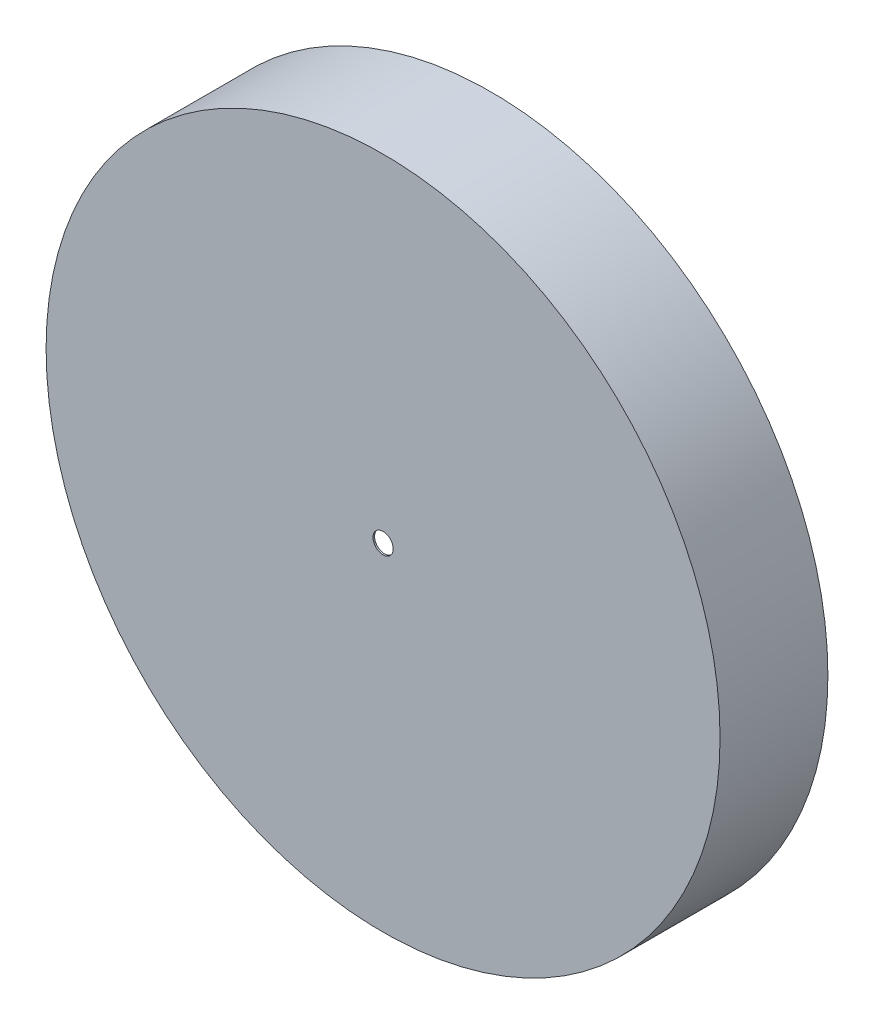
ISO-10303-21;
HEADER;
FILE_DESCRIPTION(('STEP AP214'),'2;1');
FILE_NAME('part.step','',(''),(''),'','','');
FILE_SCHEMA(('AUTOMOTIVE_DESIGN { 1 0 10303 214 1 1 1 1 }'));
ENDSEC;
DATA;
#1=APPLICATION_CONTEXT('core data for automotive mechanical design processes');
#2=APPLICATION_PROTOCOL_DEFINITION('international standard','automotive_design',2000,#1);
#3=PRODUCT_CONTEXT('',#1,'mechanical');
#4=PRODUCT('Part','Part','',(#3));
#5=PRODUCT_RELATED_PRODUCT_CATEGORY('part','',(#4));
#6=PRODUCT_DEFINITION_FORMATION('','',#4);
#7=PRODUCT_DEFINITION_CONTEXT('part definition',#1,'design');
#8=PRODUCT_DEFINITION('design','',#6,#7);
#9=PRODUCT_DEFINITION_SHAPE('','',#8);
#10=(LENGTH_UNIT() NAMED_UNIT(*) SI_UNIT(.MILLI.,.METRE.));
#11=(NAMED_UNIT(*) PLANE_ANGLE_UNIT() SI_UNIT($,.RADIAN.));
#12=(NAMED_UNIT(*) SI_UNIT($,.STERADIAN.) SOLID_ANGLE_UNIT());
#13=UNCERTAINTY_MEASURE_WITH_UNIT(LENGTH_MEASURE(1.E-05),#10,'distance_accuracy_value','');
#14=(GEOMETRIC_REPRESENTATION_CONTEXT(3) GLOBAL_UNCERTAINTY_ASSIGNED_CONTEXT((#13)) GLOBAL_UNIT_ASSIGNED_CONTEXT((#10,
#11,#12)) REPRESENTATION_CONTEXT('',''));
#15=CARTESIAN_POINT('',(0.,0.,0.));
#16=DIRECTION('',(0.,0.,1.));
#17=DIRECTION('',(1.,0.,0.));
#18=AXIS2_PLACEMENT_3D('',#15,#16,#17);
#19=CARTESIAN_POINT('',(0.,0.,80.));
#20=DIRECTION('',(0.,0.,-1.));
#21=DIRECTION('',(-1.,0.,0.));
#22=AXIS2_PLACEMENT_3D('',#19,#20,#21);
#23=CYLINDRICAL_SURFACE('',#22,250.);
#24=CARTESIAN_POINT('',(0.,0.,80.));
#25=DIRECTION('',(0.,0.,1.));
#26=DIRECTION('',(1.,0.,0.));
#27=AXIS2_PLACEMENT_3D('',#24,#25,#26);
#28=CIRCLE('',#27,250.);
#29=CARTESIAN_POINT('',(250.,0.,80.));
#30=VERTEX_POINT('',#29);
#31=EDGE_CURVE('E10',#30,#30,#28,.T.);
#32=ORIENTED_EDGE('',*,*,#31,.F.);
#33=EDGE_LOOP('',(#32));
#34=FACE_BOUND('',#33,.T.);
#35=CARTESIAN_POINT('',(0.,0.,0.));
#36=DIRECTION('',(0.,0.,1.));
#37=DIRECTION('',(1.,0.,0.));
#38=AXIS2_PLACEMENT_3D('',#35,#36,#37);
#39=CIRCLE('',#38,250.);
#40=CARTESIAN_POINT('',(250.,0.,0.));
#41=VERTEX_POINT('',#40);
#42=EDGE_CURVE('E34',#41,#41,#39,.T.);
#43=ORIENTED_EDGE('',*,*,#42,.T.);
#44=EDGE_LOOP('',(#43));
#45=FACE_BOUND('',#44,.T.);
#46=ADVANCED_FACE('F31',(#34,#45),#23,.T.);
#47=CARTESIAN_POINT('',(0.,0.,80.));
#48=DIRECTION('',(0.,0.,1.));
#49=DIRECTION('',(1.,0.,0.));
#50=AXIS2_PLACEMENT_3D('',#47,#48,#49);
#51=PLANE('',#50);
#52=CARTESIAN_POINT('',(0.,0.,80.));
#53=DIRECTION('',(0.,0.,1.));
#54=DIRECTION('',(1.,0.,0.));
#55=AXIS2_PLACEMENT_3D('',#52,#53,#54);
#56=CIRCLE('',#55,7.5);
#57=CARTESIAN_POINT('',(7.5,0.,80.));
#58=VERTEX_POINT('',#57);
#59=EDGE_CURVE('E46',#58,#58,#56,.T.);
#60=ORIENTED_EDGE('',*,*,#59,.F.);
#61=EDGE_LOOP('',(#60));
#62=FACE_BOUND('',#61,.T.);
#63=ORIENTED_EDGE('',*,*,#31,.T.);
#64=EDGE_LOOP('',(#63));
#65=FACE_BOUND('',#64,.T.);
#66=ADVANCED_FACE('F72',(#62,#65),#51,.T.);
#67=CARTESIAN_POINT('',(0.,0.,0.));
#68=DIRECTION('',(0.,0.,1.));
#69=DIRECTION('',(1.,0.,0.));
#70=AXIS2_PLACEMENT_3D('',#67,#68,#69);
#71=PLANE('',#70);
#72=CARTESIAN_POINT('',(0.,0.,0.));
#73=DIRECTION('',(0.,0.,1.));
#74=DIRECTION('',(1.,0.,0.));
#75=AXIS2_PLACEMENT_3D('',#72,#73,#74);
#76=CIRCLE('',#75,248.8);
#77=CARTESIAN_POINT('',(248.8,0.,0.));
#78=VERTEX_POINT('',#77);
#79=EDGE_CURVE('E43',#78,#78,#76,.T.);
#80=ORIENTED_EDGE('',*,*,#79,.T.);
#81=EDGE_LOOP('',(#80));
#82=FACE_BOUND('',#81,.T.);
#83=ORIENTED_EDGE('',*,*,#42,.F.);
#84=EDGE_LOOP('',(#83));
#85=FACE_BOUND('',#84,.T.);
#86=ADVANCED_FACE('F66',(#82,#85),#71,.F.);
#87=CARTESIAN_POINT('',(0.,0.,80.));
#88=DIRECTION('',(0.,0.,-1.));
#89=DIRECTION('',(-1.,0.,0.));
#90=AXIS2_PLACEMENT_3D('',#87,#88,#89);
#91=CYLINDRICAL_SURFACE('',#90,248.8);
#92=CARTESIAN_POINT('',(0.,0.,78.8));
#93=DIRECTION('',(0.,0.,1.));
#94=DIRECTION('',(1.,0.,0.));
#95=AXIS2_PLACEMENT_3D('',#92,#93,#94);
#96=CIRCLE('',#95,248.8);
#97=CARTESIAN_POINT('',(248.8,0.,78.8));
#98=VERTEX_POINT('',#97);
#99=EDGE_CURVE('E41',#98,#98,#96,.T.);
#100=ORIENTED_EDGE('',*,*,#99,.T.);
#101=EDGE_LOOP('',(#100));
#102=FACE_BOUND('',#101,.T.);
#103=ORIENTED_EDGE('',*,*,#79,.F.);
#104=EDGE_LOOP('',(#103));
#105=FACE_BOUND('',#104,.T.);
#106=ADVANCED_FACE('F60',(#102,#105),#91,.F.);
#107=CARTESIAN_POINT('',(0.,0.,78.8));
#108=DIRECTION('',(0.,0.,1.));
#109=DIRECTION('',(1.,0.,0.));
#110=AXIS2_PLACEMENT_3D('',#107,#108,#109);
#111=PLANE('',#110);
#112=CARTESIAN_POINT('',(0.,0.,78.8));
#113=DIRECTION('',(0.,0.,-1.));
#114=DIRECTION('',(-1.,0.,0.));
#115=AXIS2_PLACEMENT_3D('',#112,#113,#114);
#116=CIRCLE('',#115,7.5);
#117=CARTESIAN_POINT('',(-7.5,0.,78.8));
#118=VERTEX_POINT('',#117);
#119=EDGE_CURVE('E51',#118,#118,#116,.T.);
#120=ORIENTED_EDGE('',*,*,#119,.F.);
#121=EDGE_LOOP('',(#120));
#122=FACE_BOUND('',#121,.T.);
#123=ORIENTED_EDGE('',*,*,#99,.F.);
#124=EDGE_LOOP('',(#123));
#125=FACE_BOUND('',#124,.T.);
#126=ADVANCED_FACE('F57',(#122,#125),#111,.F.);
#127=CARTESIAN_POINT('',(0.,0.,88.8));
#128=DIRECTION('',(0.,0.,-1.));
#129=DIRECTION('',(-1.,0.,0.));
#130=AXIS2_PLACEMENT_3D('',#127,#128,#129);
#131=CYLINDRICAL_SURFACE('',#130,7.5);
#132=ORIENTED_EDGE('',*,*,#59,.T.);
#133=EDGE_LOOP('',(#132));
#134=FACE_BOUND('',#133,.T.);
#135=ORIENTED_EDGE('',*,*,#119,.T.);
#136=EDGE_LOOP('',(#135));
#137=FACE_BOUND('',#136,.T.);
#138=ADVANCED_FACE('F55',(#134,#137),#131,.F.);
#139=CLOSED_SHELL('',(#46,#66,#86,#106,#126,#138));
#140=MANIFOLD_SOLID_BREP('B2',#139);
#141=ADVANCED_BREP_SHAPE_REPRESENTATION('',(#18,#140),#14);
#142=SHAPE_DEFINITION_REPRESENTATION(#9,#141);
ENDSEC;
END-ISO-10303-21;
